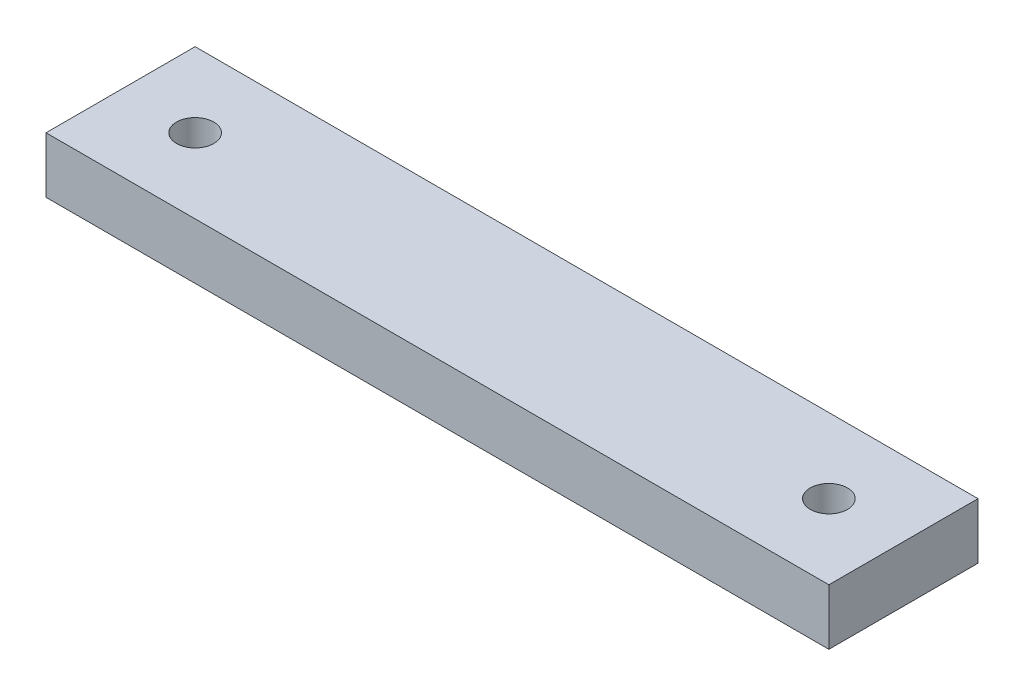
ISO-10303-21;
HEADER;
FILE_DESCRIPTION(('STEP AP214'),'2;1');
FILE_NAME('part.step','',(''),(''),'','','');
FILE_SCHEMA(('AUTOMOTIVE_DESIGN { 1 0 10303 214 1 1 1 1 }'));
ENDSEC;
DATA;
#1=APPLICATION_CONTEXT('core data for automotive mechanical design processes');
#2=APPLICATION_PROTOCOL_DEFINITION('international standard','automotive_design',2000,#1);
#3=PRODUCT_CONTEXT('',#1,'mechanical');
#4=PRODUCT('Part','Part','',(#3));
#5=PRODUCT_RELATED_PRODUCT_CATEGORY('part','',(#4));
#6=PRODUCT_DEFINITION_FORMATION('','',#4);
#7=PRODUCT_DEFINITION_CONTEXT('part definition',#1,'design');
#8=PRODUCT_DEFINITION('design','',#6,#7);
#9=PRODUCT_DEFINITION_SHAPE('','',#8);
#10=(LENGTH_UNIT() NAMED_UNIT(*) SI_UNIT(.MILLI.,.METRE.));
#11=(NAMED_UNIT(*) PLANE_ANGLE_UNIT() SI_UNIT($,.RADIAN.));
#12=(NAMED_UNIT(*) SI_UNIT($,.STERADIAN.) SOLID_ANGLE_UNIT());
#13=UNCERTAINTY_MEASURE_WITH_UNIT(LENGTH_MEASURE(1.E-05),#10,'distance_accuracy_value','');
#14=(GEOMETRIC_REPRESENTATION_CONTEXT(3) GLOBAL_UNCERTAINTY_ASSIGNED_CONTEXT((#13)) GLOBAL_UNIT_ASSIGNED_CONTEXT((#10,
#11,#12)) REPRESENTATION_CONTEXT('',''));
#15=CARTESIAN_POINT('',(0.,0.,0.));
#16=DIRECTION('',(0.,0.,1.));
#17=DIRECTION('',(1.,0.,0.));
#18=AXIS2_PLACEMENT_3D('',#15,#16,#17);
#19=CARTESIAN_POINT('',(0.,15.,0.));
#20=DIRECTION('',(0.,-1.,0.));
#21=DIRECTION('',(0.,0.,-1.));
#22=AXIS2_PLACEMENT_3D('',#19,#20,#21);
#23=PLANE('',#22);
#24=DIRECTION('',(0.,0.,-1.));
#25=VECTOR('',#24,1.);
#26=CARTESIAN_POINT('',(105.,15.,20.));
#27=LINE('',#26,#25);
#28=CARTESIAN_POINT('',(105.,15.,20.));
#29=VERTEX_POINT('',#28);
#30=CARTESIAN_POINT('',(105.,15.,-20.));
#31=VERTEX_POINT('',#30);
#32=EDGE_CURVE('E85',#29,#31,#27,.T.);
#33=ORIENTED_EDGE('',*,*,#32,.T.);
#34=DIRECTION('',(-1.,0.,0.));
#35=VECTOR('',#34,1.);
#36=CARTESIAN_POINT('',(-105.,15.,-20.));
#37=LINE('',#36,#35);
#38=CARTESIAN_POINT('',(-105.,15.,-20.));
#39=VERTEX_POINT('',#38);
#40=EDGE_CURVE('E80',#31,#39,#37,.T.);
#41=ORIENTED_EDGE('',*,*,#40,.T.);
#42=DIRECTION('',(0.,0.,1.));
#43=VECTOR('',#42,1.);
#44=CARTESIAN_POINT('',(-105.,15.,20.));
#45=LINE('',#44,#43);
#46=CARTESIAN_POINT('',(-105.,15.,20.));
#47=VERTEX_POINT('',#46);
#48=EDGE_CURVE('E83',#39,#47,#45,.T.);
#49=ORIENTED_EDGE('',*,*,#48,.T.);
#50=DIRECTION('',(1.,0.,0.));
#51=VECTOR('',#50,1.);
#52=CARTESIAN_POINT('',(-105.,15.,20.));
#53=LINE('',#52,#51);
#54=EDGE_CURVE('E50',#47,#29,#53,.T.);
#55=ORIENTED_EDGE('',*,*,#54,.T.);
#56=EDGE_LOOP('',(#33,#41,#49,#55));
#57=FACE_BOUND('',#56,.T.);
#58=CARTESIAN_POINT('',(-85.,15.,0.));
#59=DIRECTION('',(0.,1.,0.));
#60=DIRECTION('',(0.,0.,1.));
#61=AXIS2_PLACEMENT_3D('',#58,#59,#60);
#62=CIRCLE('',#61,5.);
#63=CARTESIAN_POINT('',(-85.,15.,5.));
#64=VERTEX_POINT('',#63);
#65=EDGE_CURVE('E100',#64,#64,#62,.T.);
#66=ORIENTED_EDGE('',*,*,#65,.F.);
#67=EDGE_LOOP('',(#66));
#68=FACE_BOUND('',#67,.T.);
#69=CARTESIAN_POINT('',(85.,15.,0.));
#70=DIRECTION('',(0.,1.,0.));
#71=DIRECTION('',(0.,0.,-1.));
#72=AXIS2_PLACEMENT_3D('',#69,#70,#71);
#73=CIRCLE('',#72,5.);
#74=CARTESIAN_POINT('',(85.,15.,-5.));
#75=VERTEX_POINT('',#74);
#76=EDGE_CURVE('E115',#75,#75,#73,.T.);
#77=ORIENTED_EDGE('',*,*,#76,.F.);
#78=EDGE_LOOP('',(#77));
#79=FACE_BOUND('',#78,.T.);
#80=ADVANCED_FACE('F33',(#57,#68,#79),#23,.F.);
#81=CARTESIAN_POINT('',(0.,0.,0.));
#82=DIRECTION('',(0.,-1.,0.));
#83=DIRECTION('',(0.,0.,-1.));
#84=AXIS2_PLACEMENT_3D('',#81,#82,#83);
#85=PLANE('',#84);
#86=CARTESIAN_POINT('',(-85.,0.,0.));
#87=DIRECTION('',(0.,1.,0.));
#88=DIRECTION('',(0.,0.,1.));
#89=AXIS2_PLACEMENT_3D('',#86,#87,#88);
#90=CIRCLE('',#89,5.);
#91=CARTESIAN_POINT('',(-85.,0.,5.));
#92=VERTEX_POINT('',#91);
#93=EDGE_CURVE('E112',#92,#92,#90,.T.);
#94=ORIENTED_EDGE('',*,*,#93,.T.);
#95=EDGE_LOOP('',(#94));
#96=FACE_BOUND('',#95,.T.);
#97=DIRECTION('',(0.,0.,-1.));
#98=VECTOR('',#97,1.);
#99=CARTESIAN_POINT('',(105.,0.,20.));
#100=LINE('',#99,#98);
#101=CARTESIAN_POINT('',(105.,0.,20.));
#102=VERTEX_POINT('',#101);
#103=CARTESIAN_POINT('',(105.,0.,-20.));
#104=VERTEX_POINT('',#103);
#105=EDGE_CURVE('E97',#102,#104,#100,.T.);
#106=ORIENTED_EDGE('',*,*,#105,.F.);
#107=DIRECTION('',(1.,0.,0.));
#108=VECTOR('',#107,1.);
#109=CARTESIAN_POINT('',(-105.,0.,20.));
#110=LINE('',#109,#108);
#111=CARTESIAN_POINT('',(-105.,0.,20.));
#112=VERTEX_POINT('',#111);
#113=EDGE_CURVE('E73',#112,#102,#110,.T.);
#114=ORIENTED_EDGE('',*,*,#113,.F.);
#115=DIRECTION('',(0.,0.,1.));
#116=VECTOR('',#115,1.);
#117=CARTESIAN_POINT('',(-105.,0.,20.));
#118=LINE('',#117,#116);
#119=CARTESIAN_POINT('',(-105.,0.,-20.));
#120=VERTEX_POINT('',#119);
#121=EDGE_CURVE('E67',#120,#112,#118,.T.);
#122=ORIENTED_EDGE('',*,*,#121,.F.);
#123=DIRECTION('',(-1.,0.,0.));
#124=VECTOR('',#123,1.);
#125=CARTESIAN_POINT('',(-105.,0.,-20.));
#126=LINE('',#125,#124);
#127=EDGE_CURVE('E89',#104,#120,#126,.T.);
#128=ORIENTED_EDGE('',*,*,#127,.F.);
#129=EDGE_LOOP('',(#106,#114,#122,#128));
#130=FACE_BOUND('',#129,.T.);
#131=CARTESIAN_POINT('',(85.,0.,0.));
#132=DIRECTION('',(0.,1.,0.));
#133=DIRECTION('',(0.,0.,-1.));
#134=AXIS2_PLACEMENT_3D('',#131,#132,#133);
#135=CIRCLE('',#134,5.);
#136=CARTESIAN_POINT('',(85.,0.,-5.));
#137=VERTEX_POINT('',#136);
#138=EDGE_CURVE('E118',#137,#137,#135,.T.);
#139=ORIENTED_EDGE('',*,*,#138,.T.);
#140=EDGE_LOOP('',(#139));
#141=FACE_BOUND('',#140,.T.);
#142=ADVANCED_FACE('F108',(#96,#130,#141),#85,.T.);
#143=CARTESIAN_POINT('',(105.,15.,20.));
#144=DIRECTION('',(-1.,0.,0.));
#145=DIRECTION('',(0.,0.,1.));
#146=AXIS2_PLACEMENT_3D('',#143,#144,#145);
#147=PLANE('',#146);
#148=ORIENTED_EDGE('',*,*,#105,.T.);
#149=DIRECTION('',(0.,-1.,0.));
#150=VECTOR('',#149,1.);
#151=CARTESIAN_POINT('',(105.,15.,-20.));
#152=LINE('',#151,#150);
#153=EDGE_CURVE('E11',#31,#104,#152,.T.);
#154=ORIENTED_EDGE('',*,*,#153,.F.);
#155=ORIENTED_EDGE('',*,*,#32,.F.);
#156=DIRECTION('',(0.,-1.,0.));
#157=VECTOR('',#156,1.);
#158=CARTESIAN_POINT('',(105.,15.,20.));
#159=LINE('',#158,#157);
#160=EDGE_CURVE('E93',#29,#102,#159,.T.);
#161=ORIENTED_EDGE('',*,*,#160,.T.);
#162=EDGE_LOOP('',(#148,#154,#155,#161));
#163=FACE_BOUND('',#162,.T.);
#164=ADVANCED_FACE('F35',(#163),#147,.F.);
#165=CARTESIAN_POINT('',(-105.,15.,-20.));
#166=DIRECTION('',(0.,0.,1.));
#167=DIRECTION('',(1.,0.,0.));
#168=AXIS2_PLACEMENT_3D('',#165,#166,#167);
#169=PLANE('',#168);
#170=ORIENTED_EDGE('',*,*,#127,.T.);
#171=DIRECTION('',(0.,-1.,0.));
#172=VECTOR('',#171,1.);
#173=CARTESIAN_POINT('',(-105.,15.,-20.));
#174=LINE('',#173,#172);
#175=EDGE_CURVE('E42',#39,#120,#174,.T.);
#176=ORIENTED_EDGE('',*,*,#175,.F.);
#177=ORIENTED_EDGE('',*,*,#40,.F.);
#178=ORIENTED_EDGE('',*,*,#153,.T.);
#179=EDGE_LOOP('',(#170,#176,#177,#178));
#180=FACE_BOUND('',#179,.T.);
#181=ADVANCED_FACE('F88',(#180),#169,.F.);
#182=CARTESIAN_POINT('',(-105.,15.,20.));
#183=DIRECTION('',(1.,0.,0.));
#184=DIRECTION('',(0.,0.,-1.));
#185=AXIS2_PLACEMENT_3D('',#182,#183,#184);
#186=PLANE('',#185);
#187=ORIENTED_EDGE('',*,*,#121,.T.);
#188=DIRECTION('',(0.,-1.,0.));
#189=VECTOR('',#188,1.);
#190=CARTESIAN_POINT('',(-105.,15.,20.));
#191=LINE('',#190,#189);
#192=EDGE_CURVE('E90',#47,#112,#191,.T.);
#193=ORIENTED_EDGE('',*,*,#192,.F.);
#194=ORIENTED_EDGE('',*,*,#48,.F.);
#195=ORIENTED_EDGE('',*,*,#175,.T.);
#196=EDGE_LOOP('',(#187,#193,#194,#195));
#197=FACE_BOUND('',#196,.T.);
#198=ADVANCED_FACE('F91',(#197),#186,.F.);
#199=CARTESIAN_POINT('',(-105.,15.,20.));
#200=DIRECTION('',(0.,0.,-1.));
#201=DIRECTION('',(-1.,0.,0.));
#202=AXIS2_PLACEMENT_3D('',#199,#200,#201);
#203=PLANE('',#202);
#204=ORIENTED_EDGE('',*,*,#113,.T.);
#205=ORIENTED_EDGE('',*,*,#160,.F.);
#206=ORIENTED_EDGE('',*,*,#54,.F.);
#207=ORIENTED_EDGE('',*,*,#192,.T.);
#208=EDGE_LOOP('',(#204,#205,#206,#207));
#209=FACE_BOUND('',#208,.T.);
#210=ADVANCED_FACE('F105',(#209),#203,.F.);
#211=CARTESIAN_POINT('',(-85.,15.,0.));
#212=DIRECTION('',(0.,-1.,0.));
#213=DIRECTION('',(0.,0.,-1.));
#214=AXIS2_PLACEMENT_3D('',#211,#212,#213);
#215=CYLINDRICAL_SURFACE('',#214,5.);
#216=ORIENTED_EDGE('',*,*,#65,.T.);
#217=EDGE_LOOP('',(#216));
#218=FACE_BOUND('',#217,.T.);
#219=ORIENTED_EDGE('',*,*,#93,.F.);
#220=EDGE_LOOP('',(#219));
#221=FACE_BOUND('',#220,.T.);
#222=ADVANCED_FACE('F135',(#218,#221),#215,.F.);
#223=CARTESIAN_POINT('',(85.,15.,0.));
#224=DIRECTION('',(0.,-1.,0.));
#225=DIRECTION('',(0.,0.,-1.));
#226=AXIS2_PLACEMENT_3D('',#223,#224,#225);
#227=CYLINDRICAL_SURFACE('',#226,5.);
#228=ORIENTED_EDGE('',*,*,#76,.T.);
#229=EDGE_LOOP('',(#228));
#230=FACE_BOUND('',#229,.T.);
#231=ORIENTED_EDGE('',*,*,#138,.F.);
#232=EDGE_LOOP('',(#231));
#233=FACE_BOUND('',#232,.T.);
#234=ADVANCED_FACE('F124',(#230,#233),#227,.F.);
#235=CLOSED_SHELL('',(#80,#142,#164,#181,#198,#210,#222,#234));
#236=MANIFOLD_SOLID_BREP('B2',#235);
#237=ADVANCED_BREP_SHAPE_REPRESENTATION('',(#18,#236),#14);
#238=SHAPE_DEFINITION_REPRESENTATION(#9,#237);
ENDSEC;
END-ISO-10303-21;
